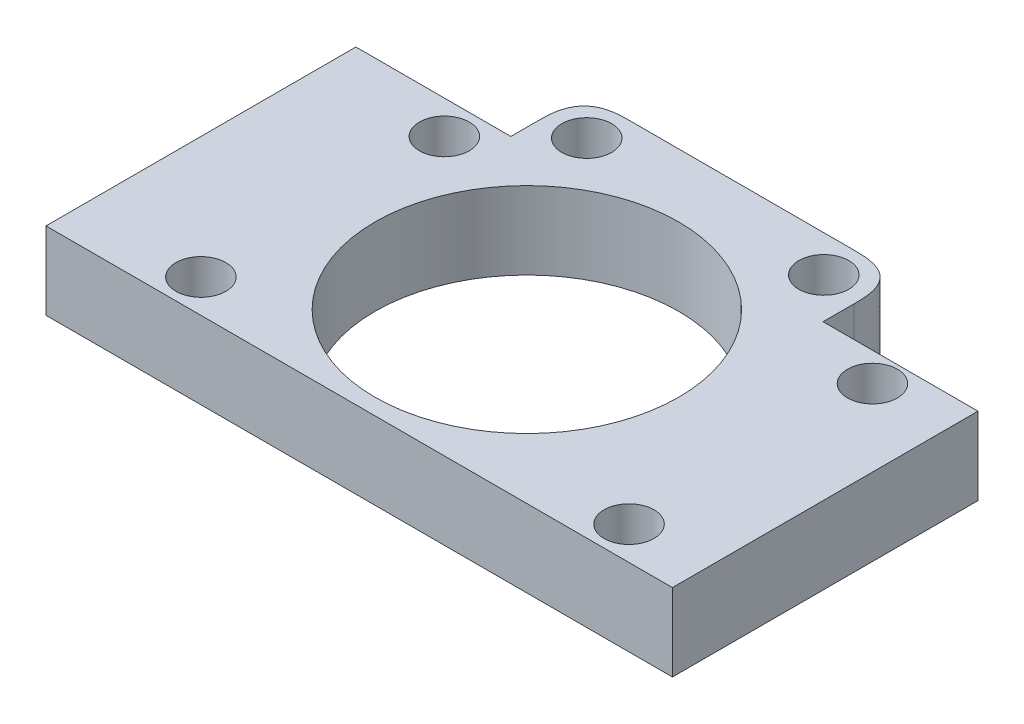
ISO-10303-21;
HEADER;
FILE_DESCRIPTION(('STEP AP214'),'2;1');
FILE_NAME('part.step','',(''),(''),'','','');
FILE_SCHEMA(('AUTOMOTIVE_DESIGN { 1 0 10303 214 1 1 1 1 }'));
ENDSEC;
DATA;
#1=APPLICATION_CONTEXT('core data for automotive mechanical design processes');
#2=APPLICATION_PROTOCOL_DEFINITION('international standard','automotive_design',2000,#1);
#3=PRODUCT_CONTEXT('',#1,'mechanical');
#4=PRODUCT('Part','Part','',(#3));
#5=PRODUCT_RELATED_PRODUCT_CATEGORY('part','',(#4));
#6=PRODUCT_DEFINITION_FORMATION('','',#4);
#7=PRODUCT_DEFINITION_CONTEXT('part definition',#1,'design');
#8=PRODUCT_DEFINITION('design','',#6,#7);
#9=PRODUCT_DEFINITION_SHAPE('','',#8);
#10=(LENGTH_UNIT() NAMED_UNIT(*) SI_UNIT(.MILLI.,.METRE.));
#11=(NAMED_UNIT(*) PLANE_ANGLE_UNIT() SI_UNIT($,.RADIAN.));
#12=(NAMED_UNIT(*) SI_UNIT($,.STERADIAN.) SOLID_ANGLE_UNIT());
#13=UNCERTAINTY_MEASURE_WITH_UNIT(LENGTH_MEASURE(1.E-05),#10,'distance_accuracy_value','');
#14=(GEOMETRIC_REPRESENTATION_CONTEXT(3) GLOBAL_UNCERTAINTY_ASSIGNED_CONTEXT((#13)) GLOBAL_UNIT_ASSIGNED_CONTEXT((#10,
#11,#12)) REPRESENTATION_CONTEXT('',''));
#15=CARTESIAN_POINT('',(0.,0.,0.));
#16=DIRECTION('',(0.,0.,1.));
#17=DIRECTION('',(1.,0.,0.));
#18=AXIS2_PLACEMENT_3D('',#15,#16,#17);
#19=CARTESIAN_POINT('',(-10.1929890126689,3.,-8.91469052277428));
#20=CARTESIAN_POINT('',(-10.1929890126689,0.999999999999783,-8.91469052277428));
#21=CARTESIAN_POINT('',(-10.1929890126689,-1.,-8.91469052277428));
#22=CARTESIAN_POINT('',(-10.1929890126689,-3.,-8.91469052277428));
#23=CARTESIAN_POINT('',(-10.1929890126689,3.,-9.41928467737612));
#24=CARTESIAN_POINT('',(-10.1929890126689,0.999999999999783,-9.41928467737612));
#25=CARTESIAN_POINT('',(-10.1929890126689,-1.,-9.41928467737612));
#26=CARTESIAN_POINT('',(-10.1929890126689,-3.,-9.41928467737612));
#27=CARTESIAN_POINT('',(-10.1929890126689,3.,-9.92387883197796));
#28=CARTESIAN_POINT('',(-10.1929890126689,0.999999999999783,-9.92387883197796));
#29=CARTESIAN_POINT('',(-10.1929890126689,-1.,-9.92387883197796));
#30=CARTESIAN_POINT('',(-10.1929890126689,-3.,-9.92387883197796));
#31=CARTESIAN_POINT('',(-9.97791325316063,3.,-11.0360108663339));
#32=CARTESIAN_POINT('',(-9.97791325316063,0.999999999999783,-11.0360108663339));
#33=CARTESIAN_POINT('',(-9.97791325316063,-1.,-11.0360108663322));
#34=CARTESIAN_POINT('',(-9.97791325316063,-3.,-11.0360108663339));
#35=CARTESIAN_POINT('',(-9.31430935622852,3.,-11.699614763266));
#36=CARTESIAN_POINT('',(-9.31430935622852,0.999999999999783,-11.699614763266));
#37=CARTESIAN_POINT('',(-9.31430935622852,-1.,-11.6996147632643));
#38=CARTESIAN_POINT('',(-9.31430935622852,-3.,-11.699614763266));
#39=CARTESIAN_POINT('',(-8.20217732187255,3.,-11.9146905227743));
#40=CARTESIAN_POINT('',(-8.20217732187255,0.999999999999783,-11.9146905227743));
#41=CARTESIAN_POINT('',(-8.20217732187255,-1.,-11.9146905227726));
#42=CARTESIAN_POINT('',(-8.20217732187255,-3.,-11.9146905227743));
#43=CARTESIAN_POINT('',(-7.69758316727071,3.,-11.9146905227743));
#44=CARTESIAN_POINT('',(-7.69758316727071,0.999999999999783,-11.9146905227743));
#45=CARTESIAN_POINT('',(-7.69758316727071,-1.,-11.9146905227726));
#46=CARTESIAN_POINT('',(-7.69758316727071,-3.,-11.9146905227743));
#47=CARTESIAN_POINT('',(-7.19298901266887,3.,-11.9146905227743));
#48=CARTESIAN_POINT('',(-7.19298901266887,0.999999999999783,-11.9146905227743));
#49=CARTESIAN_POINT('',(-7.19298901266887,-1.,-11.9146905227743));
#50=CARTESIAN_POINT('',(-7.19298901266887,-3.,-11.9146905227743));
#51=B_SPLINE_SURFACE_WITH_KNOTS('',5,3,((#19,#20,#21,#22),(#23,#24,#25,#26),(#27,#28,#29,#30),
(#31,#32,#33,#34),(#35,#36,#37,#38),(#39,#40,#41,#42),(#43,#44,#45,#46),(#47,#48,#49,#50)),
.UNSPECIFIED.,.F.,.F.,.F.,(6,2,6),(4,4),(0.,0.5,1.),(-0.0005,0.0055),.UNSPECIFIED.);
#52=CARTESIAN_POINT('',(-10.1929890126689,-3.,-8.91469052277428));
#53=CARTESIAN_POINT('',(-10.1929890126689,-1.,-8.91469052277428));
#54=CARTESIAN_POINT('',(-10.1929890126689,0.999999999999783,-8.91469052277428));
#55=CARTESIAN_POINT('',(-10.1929890126689,3.,-8.91469052277428));
#56=B_SPLINE_CURVE_WITH_KNOTS('',3,(#52,#53,#54,#55),.UNSPECIFIED.,.F.,.F.,(4,4),(-0.0005,
0.0055),.UNSPECIFIED.);
#57=CARTESIAN_POINT('',(-10.1929890126689,2.5,-8.91469052277428));
#58=VERTEX_POINT('',#57);
#59=CARTESIAN_POINT('',(-10.1929890126689,-2.5,-8.91469052277428));
#60=VERTEX_POINT('',#59);
#61=EDGE_CURVE('E359',#58,#60,#56,.F.);
#62=CARTESIAN_POINT('',(-10.1929890126689,2.5,-8.91469052277428));
#63=CARTESIAN_POINT('',(-10.1929890126689,2.5,-9.41928467737612));
#64=CARTESIAN_POINT('',(-10.1929890126689,2.5,-9.92387883197796));
#65=CARTESIAN_POINT('',(-9.97791325316063,2.5,-11.0360108663339));
#66=CARTESIAN_POINT('',(-9.31430935622852,2.5,-11.699614763266));
#67=CARTESIAN_POINT('',(-8.20217732187255,2.5,-11.9146905227743));
#68=CARTESIAN_POINT('',(-7.69758316727071,2.5,-11.9146905227743));
#69=CARTESIAN_POINT('',(-7.19298901266887,2.5,-11.9146905227743));
#70=B_SPLINE_CURVE_WITH_KNOTS('',5,(#62,#63,#64,#65,#66,#67,#68,#69),.UNSPECIFIED.,.F.,.F.,(6,2,
6),(0.,0.5,1.),.UNSPECIFIED.);
#71=CARTESIAN_POINT('',(-7.19298901266887,2.5,-11.9146905227743));
#72=VERTEX_POINT('',#71);
#73=EDGE_CURVE('E244',#72,#58,#70,.F.);
#74=CARTESIAN_POINT('',(-7.19298901266887,3.,-11.9146905227743));
#75=CARTESIAN_POINT('',(-7.19298901266887,0.999999999999783,-11.9146905227743));
#76=CARTESIAN_POINT('',(-7.19298901266887,-1.,-11.9146905227743));
#77=CARTESIAN_POINT('',(-7.19298901266887,-3.,-11.9146905227743));
#78=B_SPLINE_CURVE_WITH_KNOTS('',3,(#74,#75,#76,#77),.UNSPECIFIED.,.F.,.F.,(4,4),(-0.0005,
0.0055),.UNSPECIFIED.);
#79=CARTESIAN_POINT('',(-7.19298901266887,-2.5,-11.9146905227743));
#80=VERTEX_POINT('',#79);
#81=EDGE_CURVE('E483',#80,#72,#78,.F.);
#82=CARTESIAN_POINT('',(-7.19298901266887,-2.5,-11.9146905227743));
#83=CARTESIAN_POINT('',(-7.69758316727071,-2.5,-11.9146905227739));
#84=CARTESIAN_POINT('',(-8.20217732187255,-2.5,-11.9146905227739));
#85=CARTESIAN_POINT('',(-9.31430935622852,-2.5,-11.6996147632657));
#86=CARTESIAN_POINT('',(-9.97791325316063,-2.5,-11.0360108663336));
#87=CARTESIAN_POINT('',(-10.1929890126689,-2.5,-9.92387883197796));
#88=CARTESIAN_POINT('',(-10.1929890126689,-2.5,-9.41928467737612));
#89=CARTESIAN_POINT('',(-10.1929890126689,-2.5,-8.91469052277428));
#90=B_SPLINE_CURVE_WITH_KNOTS('',5,(#82,#83,#84,#85,#86,#87,#88,#89),.UNSPECIFIED.,.F.,.F.,(6,2,
6),(0.,0.5,1.),.UNSPECIFIED.);
#91=EDGE_CURVE('E12',#60,#80,#90,.F.);
#92=ORIENTED_EDGE('',*,*,#61,.F.);
#93=ORIENTED_EDGE('',*,*,#73,.F.);
#94=ORIENTED_EDGE('',*,*,#81,.F.);
#95=ORIENTED_EDGE('',*,*,#91,.F.);
#96=EDGE_LOOP('',(#92,#93,#94,#95));
#97=FACE_BOUND('',#96,.T.);
#98=ADVANCED_FACE('F230',(#97),#51,.T.);
#99=CARTESIAN_POINT('',(10.2370109873311,-3.,-8.91469052277429));
#100=CARTESIAN_POINT('',(10.2370109873311,-1.,-8.91469052277429));
#101=CARTESIAN_POINT('',(10.2370109873311,0.999999999999349,-8.91469052277429));
#102=CARTESIAN_POINT('',(10.2370109873311,3.,-8.91469052277429));
#103=CARTESIAN_POINT('',(10.2370109873311,-3.,-9.41928467737613));
#104=CARTESIAN_POINT('',(10.2370109873311,-1.,-9.41928467737613));
#105=CARTESIAN_POINT('',(10.2370109873311,0.999999999999349,-9.41928467737613));
#106=CARTESIAN_POINT('',(10.2370109873311,3.,-9.41928467737613));
#107=CARTESIAN_POINT('',(10.2370109873311,-3.,-9.92387883197797));
#108=CARTESIAN_POINT('',(10.2370109873311,-1.,-9.92387883197797));
#109=CARTESIAN_POINT('',(10.2370109873311,0.999999999999349,-9.92387883197797));
#110=CARTESIAN_POINT('',(10.2370109873311,3.,-9.92387883197797));
#111=CARTESIAN_POINT('',(10.0219352278229,-3.,-11.0360108663339));
#112=CARTESIAN_POINT('',(10.0219352278211,-1.,-11.0360108663357));
#113=CARTESIAN_POINT('',(10.0219352278211,0.999999999999349,-11.0360108663357));
#114=CARTESIAN_POINT('',(10.0219352278229,3.,-11.0360108663339));
#115=CARTESIAN_POINT('',(9.35833133089077,-3.,-11.699614763266));
#116=CARTESIAN_POINT('',(9.35833133089077,-1.,-11.699614763266));
#117=CARTESIAN_POINT('',(9.35833133089077,0.999999999999349,-11.699614763266));
#118=CARTESIAN_POINT('',(9.35833133089077,3.,-11.699614763266));
#119=CARTESIAN_POINT('',(8.24619929653481,-3.,-11.9146905227743));
#120=CARTESIAN_POINT('',(8.24619929653654,-1.,-11.9146905227726));
#121=CARTESIAN_POINT('',(8.24619929653654,0.999999999999349,-11.9146905227726));
#122=CARTESIAN_POINT('',(8.24619929653481,3.,-11.9146905227743));
#123=CARTESIAN_POINT('',(7.74160514193297,-3.,-11.9146905227743));
#124=CARTESIAN_POINT('',(7.74160514193297,-1.,-11.9146905227726));
#125=CARTESIAN_POINT('',(7.74160514193297,0.999999999999349,-11.9146905227726));
#126=CARTESIAN_POINT('',(7.74160514193297,3.,-11.9146905227743));
#127=CARTESIAN_POINT('',(7.23701098733113,-3.,-11.9146905227743));
#128=CARTESIAN_POINT('',(7.23701098733113,-1.,-11.9146905227743));
#129=CARTESIAN_POINT('',(7.23701098733113,0.999999999999349,-11.9146905227743));
#130=CARTESIAN_POINT('',(7.23701098733113,3.,-11.9146905227743));
#131=B_SPLINE_SURFACE_WITH_KNOTS('',5,3,((#99,#100,#101,#102),(#103,#104,#105,#106),(#107,#108,
#109,#110),(#111,#112,#113,#114),(#115,#116,#117,#118),(#119,#120,#121,#122),(#123,#124,#125,
#126),(#127,#128,#129,#130)),.UNSPECIFIED.,.F.,.F.,.F.,(6,2,6),(4,4),(0.,0.5,1.),(-0.0055,
0.0005),.UNSPECIFIED.);
#132=CARTESIAN_POINT('',(10.2370109873311,3.,-8.91469052277429));
#133=CARTESIAN_POINT('',(10.2370109873311,0.999999999999349,-8.91469052277429));
#134=CARTESIAN_POINT('',(10.2370109873311,-1.,-8.91469052277429));
#135=CARTESIAN_POINT('',(10.2370109873311,-3.,-8.91469052277429));
#136=B_SPLINE_CURVE_WITH_KNOTS('',3,(#132,#133,#134,#135),.UNSPECIFIED.,.F.,.F.,(4,4),(-0.0055,
0.0005),.UNSPECIFIED.);
#137=CARTESIAN_POINT('',(10.2370109873311,-2.5,-8.91469052277429));
#138=VERTEX_POINT('',#137);
#139=CARTESIAN_POINT('',(10.2370109873311,2.5,-8.91469052277429));
#140=VERTEX_POINT('',#139);
#141=EDGE_CURVE('E429',#138,#140,#136,.F.);
#142=CARTESIAN_POINT('',(10.2370109873311,-2.5,-8.91469052277429));
#143=CARTESIAN_POINT('',(10.2370109873311,-2.5,-9.41928467737613));
#144=CARTESIAN_POINT('',(10.2370109873311,-2.5,-9.92387883197797));
#145=CARTESIAN_POINT('',(10.0219352278225,-2.5,-11.0360108663343));
#146=CARTESIAN_POINT('',(9.35833133089077,-2.5,-11.699614763266));
#147=CARTESIAN_POINT('',(8.24619929653521,-2.5,-11.9146905227739));
#148=CARTESIAN_POINT('',(7.74160514193297,-2.5,-11.9146905227739));
#149=CARTESIAN_POINT('',(7.23701098733113,-2.5,-11.9146905227743));
#150=B_SPLINE_CURVE_WITH_KNOTS('',5,(#142,#143,#144,#145,#146,#147,#148,#149),.UNSPECIFIED.,.F.,
.F.,(6,2,6),(0.,0.5,1.),.UNSPECIFIED.);
#151=CARTESIAN_POINT('',(7.23701098733113,-2.5,-11.9146905227743));
#152=VERTEX_POINT('',#151);
#153=EDGE_CURVE('E436',#152,#138,#150,.F.);
#154=CARTESIAN_POINT('',(7.23701098733113,-3.,-11.9146905227743));
#155=CARTESIAN_POINT('',(7.23701098733113,-1.,-11.9146905227743));
#156=CARTESIAN_POINT('',(7.23701098733113,0.999999999999349,-11.9146905227743));
#157=CARTESIAN_POINT('',(7.23701098733113,3.,-11.9146905227743));
#158=B_SPLINE_CURVE_WITH_KNOTS('',3,(#154,#155,#156,#157),.UNSPECIFIED.,.F.,.F.,(4,4),(-0.0055,
0.0005),.UNSPECIFIED.);
#159=CARTESIAN_POINT('',(7.23701098733113,2.5,-11.9146905227743));
#160=VERTEX_POINT('',#159);
#161=EDGE_CURVE('E432',#160,#152,#158,.F.);
#162=CARTESIAN_POINT('',(7.23701098733113,2.5,-11.9146905227743));
#163=CARTESIAN_POINT('',(7.74160514193297,2.5,-11.9146905227739));
#164=CARTESIAN_POINT('',(8.2461992965352,2.5,-11.9146905227739));
#165=CARTESIAN_POINT('',(9.35833133089077,2.5,-11.699614763266));
#166=CARTESIAN_POINT('',(10.0219352278225,2.5,-11.0360108663343));
#167=CARTESIAN_POINT('',(10.2370109873311,2.5,-9.92387883197797));
#168=CARTESIAN_POINT('',(10.2370109873311,2.5,-9.41928467737613));
#169=CARTESIAN_POINT('',(10.2370109873311,2.5,-8.91469052277429));
#170=B_SPLINE_CURVE_WITH_KNOTS('',5,(#162,#163,#164,#165,#166,#167,#168,#169),.UNSPECIFIED.,.F.,
.F.,(6,2,6),(0.,0.5,1.),.UNSPECIFIED.);
#171=EDGE_CURVE('E420',#140,#160,#170,.F.);
#172=ORIENTED_EDGE('',*,*,#141,.F.);
#173=ORIENTED_EDGE('',*,*,#153,.F.);
#174=ORIENTED_EDGE('',*,*,#161,.F.);
#175=ORIENTED_EDGE('',*,*,#171,.F.);
#176=EDGE_LOOP('',(#172,#173,#174,#175));
#177=FACE_BOUND('',#176,.T.);
#178=ADVANCED_FACE('F382',(#177),#131,.T.);
#179=CARTESIAN_POINT('',(0.,2.5,0.));
#180=DIRECTION('',(0.,1.,0.));
#181=DIRECTION('',(0.,0.,1.));
#182=AXIS2_PLACEMENT_3D('',#179,#180,#181);
#183=PLANE('',#182);
#184=CARTESIAN_POINT('',(7.64576839590492,2.5,-9.55353549817908));
#185=DIRECTION('',(0.,1.,0.));
#186=DIRECTION('',(0.,0.,1.));
#187=AXIS2_PLACEMENT_3D('',#184,#185,#186);
#188=CIRCLE('',#187,1.61029889540952);
#189=CARTESIAN_POINT('',(7.64576839590492,2.5,-7.94323660276957));
#190=VERTEX_POINT('',#189);
#191=EDGE_CURVE('E659',#190,#190,#188,.T.);
#192=ORIENTED_EDGE('',*,*,#191,.F.);
#193=EDGE_LOOP('',(#192));
#194=FACE_BOUND('',#193,.T.);
#195=CARTESIAN_POINT('',(15.2901081666769,2.5,10.6606083726352));
#196=DIRECTION('',(0.,1.,0.));
#197=DIRECTION('',(0.,0.,1.));
#198=AXIS2_PLACEMENT_3D('',#195,#196,#197);
#199=CIRCLE('',#198,1.61029889540952);
#200=CARTESIAN_POINT('',(15.2901081666769,2.5,12.2709072680447));
#201=VERTEX_POINT('',#200);
#202=EDGE_CURVE('E643',#201,#201,#199,.T.);
#203=ORIENTED_EDGE('',*,*,#202,.F.);
#204=EDGE_LOOP('',(#203));
#205=FACE_BOUND('',#204,.T.);
#206=CARTESIAN_POINT('',(-12.3398918333231,2.5,10.6605087408321));
#207=DIRECTION('',(0.,1.,0.));
#208=DIRECTION('',(0.,0.,1.));
#209=AXIS2_PLACEMENT_3D('',#206,#207,#208);
#210=CIRCLE('',#209,1.61019926360635);
#211=CARTESIAN_POINT('',(-12.3398918333231,2.5,12.2707080044384));
#212=VERTEX_POINT('',#211);
#213=EDGE_CURVE('E628',#212,#212,#210,.T.);
#214=ORIENTED_EDGE('',*,*,#213,.F.);
#215=EDGE_LOOP('',(#214));
#216=FACE_BOUND('',#215,.T.);
#217=DIRECTION('',(1.,0.,0.));
#218=VECTOR('',#217,1.);
#219=CARTESIAN_POINT('',(-10.1929890126689,2.5,-11.9146905227743));
#220=LINE('',#219,#218);
#221=EDGE_CURVE('E334',#72,#160,#220,.T.);
#222=ORIENTED_EDGE('',*,*,#221,.F.);
#223=ORIENTED_EDGE('',*,*,#73,.T.);
#224=DIRECTION('',(0.,0.,-1.));
#225=VECTOR('',#224,1.);
#226=CARTESIAN_POINT('',(-10.1929890126689,2.5,-7.19469052277429));
#227=LINE('',#226,#225);
#228=CARTESIAN_POINT('',(-10.1929890126689,2.5,-7.19469052277429));
#229=VERTEX_POINT('',#228);
#230=EDGE_CURVE('E316',#229,#58,#227,.T.);
#231=ORIENTED_EDGE('',*,*,#230,.F.);
#232=DIRECTION('',(1.,0.,0.));
#233=VECTOR('',#232,1.);
#234=CARTESIAN_POINT('',(-20.1929890126689,2.5,-7.19469052277429));
#235=LINE('',#234,#233);
#236=CARTESIAN_POINT('',(-20.1929890126689,2.5,-7.19469052277429));
#237=VERTEX_POINT('',#236);
#238=EDGE_CURVE('E331',#237,#229,#235,.T.);
#239=ORIENTED_EDGE('',*,*,#238,.F.);
#240=DIRECTION('',(0.,0.,1.));
#241=VECTOR('',#240,1.);
#242=CARTESIAN_POINT('',(-20.1929890126689,2.5,-7.19469052277429));
#243=LINE('',#242,#241);
#244=CARTESIAN_POINT('',(-20.1929890126689,2.5,12.8053094772257));
#245=VERTEX_POINT('',#244);
#246=EDGE_CURVE('E324',#237,#245,#243,.T.);
#247=ORIENTED_EDGE('',*,*,#246,.T.);
#248=DIRECTION('',(-1.,0.,0.));
#249=VECTOR('',#248,1.);
#250=CARTESIAN_POINT('',(20.2370109873311,2.5,12.8053094772257));
#251=LINE('',#250,#249);
#252=CARTESIAN_POINT('',(20.2370109873311,2.5,12.8053094772257));
#253=VERTEX_POINT('',#252);
#254=EDGE_CURVE('E463',#253,#245,#251,.T.);
#255=ORIENTED_EDGE('',*,*,#254,.F.);
#256=DIRECTION('',(0.,0.,1.));
#257=VECTOR('',#256,1.);
#258=CARTESIAN_POINT('',(20.2370109873311,2.5,-6.91469052277429));
#259=LINE('',#258,#257);
#260=CARTESIAN_POINT('',(20.2370109873311,2.5,-6.91469052277429));
#261=VERTEX_POINT('',#260);
#262=EDGE_CURVE('E454',#261,#253,#259,.T.);
#263=ORIENTED_EDGE('',*,*,#262,.F.);
#264=DIRECTION('',(1.,0.,0.));
#265=VECTOR('',#264,1.);
#266=CARTESIAN_POINT('',(10.2370109873311,2.5,-6.91469052277429));
#267=LINE('',#266,#265);
#268=CARTESIAN_POINT('',(10.2370109873311,2.5,-6.91469052277429));
#269=VERTEX_POINT('',#268);
#270=EDGE_CURVE('E450',#269,#261,#267,.T.);
#271=ORIENTED_EDGE('',*,*,#270,.F.);
#272=DIRECTION('',(0.,0.,1.));
#273=VECTOR('',#272,1.);
#274=CARTESIAN_POINT('',(10.2370109873311,2.5,-11.9146905227743));
#275=LINE('',#274,#273);
#276=EDGE_CURVE('E441',#140,#269,#275,.T.);
#277=ORIENTED_EDGE('',*,*,#276,.F.);
#278=ORIENTED_EDGE('',*,*,#171,.T.);
#279=EDGE_LOOP('',(#222,#223,#231,#239,#247,#255,#263,#271,#277,#278));
#280=FACE_BOUND('',#279,.T.);
#281=CARTESIAN_POINT('',(-12.3398918333231,2.5,-5.04969052277429));
#282=DIRECTION('',(0.,1.,0.));
#283=DIRECTION('',(0.,0.,1.));
#284=AXIS2_PLACEMENT_3D('',#281,#282,#283);
#285=CIRCLE('',#284,1.61);
#286=CARTESIAN_POINT('',(-12.3398918333231,2.5,-3.43969052277429));
#287=VERTEX_POINT('',#286);
#288=EDGE_CURVE('E471',#287,#287,#285,.T.);
#289=ORIENTED_EDGE('',*,*,#288,.F.);
#290=EDGE_LOOP('',(#289));
#291=FACE_BOUND('',#290,.T.);
#292=CARTESIAN_POINT('',(0.,2.5,1.96530947722571));
#293=DIRECTION('',(0.,1.,0.));
#294=DIRECTION('',(0.,0.,1.));
#295=AXIS2_PLACEMENT_3D('',#292,#293,#294);
#296=CIRCLE('',#295,9.8);
#297=CARTESIAN_POINT('',(0.,2.5,11.7653094772257));
#298=VERTEX_POINT('',#297);
#299=EDGE_CURVE('E635',#298,#298,#296,.T.);
#300=ORIENTED_EDGE('',*,*,#299,.F.);
#301=EDGE_LOOP('',(#300));
#302=FACE_BOUND('',#301,.T.);
#303=CARTESIAN_POINT('',(15.2901081666769,2.5,-5.04969052277429));
#304=DIRECTION('',(0.,1.,0.));
#305=DIRECTION('',(0.,0.,1.));
#306=AXIS2_PLACEMENT_3D('',#303,#304,#305);
#307=CIRCLE('',#306,1.61000000000001);
#308=CARTESIAN_POINT('',(15.2901081666769,2.5,-3.43969052277429));
#309=VERTEX_POINT('',#308);
#310=EDGE_CURVE('E651',#309,#309,#307,.T.);
#311=ORIENTED_EDGE('',*,*,#310,.F.);
#312=EDGE_LOOP('',(#311));
#313=FACE_BOUND('',#312,.T.);
#314=CARTESIAN_POINT('',(-7.65376201202699,2.5,-9.55353549817908));
#315=DIRECTION('',(0.,1.,0.));
#316=DIRECTION('',(0.,0.,1.));
#317=AXIS2_PLACEMENT_3D('',#314,#315,#316);
#318=CIRCLE('',#317,1.61029889540952);
#319=CARTESIAN_POINT('',(-7.65376201202699,2.5,-7.94323660276957));
#320=VERTEX_POINT('',#319);
#321=EDGE_CURVE('E667',#320,#320,#318,.T.);
#322=ORIENTED_EDGE('',*,*,#321,.F.);
#323=EDGE_LOOP('',(#322));
#324=FACE_BOUND('',#323,.T.);
#325=ADVANCED_FACE('F329',(#194,#205,#216,#280,#291,#302,#313,#324),#183,.T.);
#326=CARTESIAN_POINT('',(0.,-2.5,0.));
#327=DIRECTION('',(0.,1.,0.));
#328=DIRECTION('',(0.,0.,1.));
#329=AXIS2_PLACEMENT_3D('',#326,#327,#328);
#330=PLANE('',#329);
#331=DIRECTION('',(0.,0.,-1.));
#332=VECTOR('',#331,1.);
#333=CARTESIAN_POINT('',(-10.1929890126689,-2.5,-7.19469052277429));
#334=LINE('',#333,#332);
#335=CARTESIAN_POINT('',(-10.1929890126689,-2.5,-7.19469052277429));
#336=VERTEX_POINT('',#335);
#337=EDGE_CURVE('E317',#336,#60,#334,.T.);
#338=ORIENTED_EDGE('',*,*,#337,.T.);
#339=ORIENTED_EDGE('',*,*,#91,.T.);
#340=DIRECTION('',(1.,0.,0.));
#341=VECTOR('',#340,1.);
#342=CARTESIAN_POINT('',(-10.1929890126689,-2.5,-11.9146905227743));
#343=LINE('',#342,#341);
#344=EDGE_CURVE('E477',#80,#152,#343,.T.);
#345=ORIENTED_EDGE('',*,*,#344,.T.);
#346=ORIENTED_EDGE('',*,*,#153,.T.);
#347=DIRECTION('',(0.,0.,1.));
#348=VECTOR('',#347,1.);
#349=CARTESIAN_POINT('',(10.2370109873311,-2.5,-11.9146905227743));
#350=LINE('',#349,#348);
#351=CARTESIAN_POINT('',(10.2370109873311,-2.5,-6.91469052277429));
#352=VERTEX_POINT('',#351);
#353=EDGE_CURVE('E443',#138,#352,#350,.T.);
#354=ORIENTED_EDGE('',*,*,#353,.T.);
#355=DIRECTION('',(1.,0.,0.));
#356=VECTOR('',#355,1.);
#357=CARTESIAN_POINT('',(10.2370109873311,-2.5,-6.91469052277429));
#358=LINE('',#357,#356);
#359=CARTESIAN_POINT('',(20.2370109873311,-2.5,-6.91469052277429));
#360=VERTEX_POINT('',#359);
#361=EDGE_CURVE('E618',#352,#360,#358,.T.);
#362=ORIENTED_EDGE('',*,*,#361,.T.);
#363=DIRECTION('',(0.,0.,1.));
#364=VECTOR('',#363,1.);
#365=CARTESIAN_POINT('',(20.2370109873311,-2.5,-6.91469052277429));
#366=LINE('',#365,#364);
#367=CARTESIAN_POINT('',(20.2370109873311,-2.5,12.8053094772257));
#368=VERTEX_POINT('',#367);
#369=EDGE_CURVE('E615',#360,#368,#366,.T.);
#370=ORIENTED_EDGE('',*,*,#369,.T.);
#371=DIRECTION('',(-1.,0.,0.));
#372=VECTOR('',#371,1.);
#373=CARTESIAN_POINT('',(20.2370109873311,-2.5,12.8053094772257));
#374=LINE('',#373,#372);
#375=CARTESIAN_POINT('',(-20.1929890126689,-2.5,12.8053094772257));
#376=VERTEX_POINT('',#375);
#377=EDGE_CURVE('E344',#368,#376,#374,.T.);
#378=ORIENTED_EDGE('',*,*,#377,.T.);
#379=DIRECTION('',(0.,0.,1.));
#380=VECTOR('',#379,1.);
#381=CARTESIAN_POINT('',(-20.1929890126689,-2.5,-7.19469052277429));
#382=LINE('',#381,#380);
#383=CARTESIAN_POINT('',(-20.1929890126689,-2.5,-7.19469052277429));
#384=VERTEX_POINT('',#383);
#385=EDGE_CURVE('E340',#384,#376,#382,.T.);
#386=ORIENTED_EDGE('',*,*,#385,.F.);
#387=DIRECTION('',(1.,0.,0.));
#388=VECTOR('',#387,1.);
#389=CARTESIAN_POINT('',(-20.1929890126689,-2.5,-7.19469052277429));
#390=LINE('',#389,#388);
#391=EDGE_CURVE('E469',#384,#336,#390,.T.);
#392=ORIENTED_EDGE('',*,*,#391,.T.);
#393=EDGE_LOOP('',(#338,#339,#345,#346,#354,#362,#370,#378,#386,#392));
#394=FACE_BOUND('',#393,.T.);
#395=CARTESIAN_POINT('',(-12.3398918333231,-2.5,-5.04969052277429));
#396=DIRECTION('',(0.,1.,0.));
#397=DIRECTION('',(0.,0.,1.));
#398=AXIS2_PLACEMENT_3D('',#395,#396,#397);
#399=CIRCLE('',#398,1.61);
#400=CARTESIAN_POINT('',(-12.3398918333231,-2.5,-3.43969052277429));
#401=VERTEX_POINT('',#400);
#402=EDGE_CURVE('E348',#401,#401,#399,.T.);
#403=ORIENTED_EDGE('',*,*,#402,.T.);
#404=EDGE_LOOP('',(#403));
#405=FACE_BOUND('',#404,.T.);
#406=CARTESIAN_POINT('',(-12.3398918333231,-2.5,10.6605087408321));
#407=DIRECTION('',(0.,1.,0.));
#408=DIRECTION('',(0.,0.,1.));
#409=AXIS2_PLACEMENT_3D('',#406,#407,#408);
#410=CIRCLE('',#409,1.61019926360635);
#411=CARTESIAN_POINT('',(-12.3398918333231,-2.5,12.2707080044384));
#412=VERTEX_POINT('',#411);
#413=EDGE_CURVE('E631',#412,#412,#410,.T.);
#414=ORIENTED_EDGE('',*,*,#413,.T.);
#415=EDGE_LOOP('',(#414));
#416=FACE_BOUND('',#415,.T.);
#417=CARTESIAN_POINT('',(0.,-2.5,1.96530947722571));
#418=DIRECTION('',(0.,1.,0.));
#419=DIRECTION('',(0.,0.,1.));
#420=AXIS2_PLACEMENT_3D('',#417,#418,#419);
#421=CIRCLE('',#420,9.8);
#422=CARTESIAN_POINT('',(0.,-2.5,11.7653094772257));
#423=VERTEX_POINT('',#422);
#424=EDGE_CURVE('E639',#423,#423,#421,.T.);
#425=ORIENTED_EDGE('',*,*,#424,.T.);
#426=EDGE_LOOP('',(#425));
#427=FACE_BOUND('',#426,.T.);
#428=CARTESIAN_POINT('',(15.2901081666769,-2.5,10.6606083726352));
#429=DIRECTION('',(0.,1.,0.));
#430=DIRECTION('',(0.,0.,1.));
#431=AXIS2_PLACEMENT_3D('',#428,#429,#430);
#432=CIRCLE('',#431,1.61029889540952);
#433=CARTESIAN_POINT('',(15.2901081666769,-2.5,12.2709072680447));
#434=VERTEX_POINT('',#433);
#435=EDGE_CURVE('E647',#434,#434,#432,.T.);
#436=ORIENTED_EDGE('',*,*,#435,.T.);
#437=EDGE_LOOP('',(#436));
#438=FACE_BOUND('',#437,.T.);
#439=CARTESIAN_POINT('',(15.2901081666769,-2.5,-5.04969052277429));
#440=DIRECTION('',(0.,1.,0.));
#441=DIRECTION('',(0.,0.,1.));
#442=AXIS2_PLACEMENT_3D('',#439,#440,#441);
#443=CIRCLE('',#442,1.61000000000001);
#444=CARTESIAN_POINT('',(15.2901081666769,-2.5,-3.43969052277429));
#445=VERTEX_POINT('',#444);
#446=EDGE_CURVE('E655',#445,#445,#443,.T.);
#447=ORIENTED_EDGE('',*,*,#446,.T.);
#448=EDGE_LOOP('',(#447));
#449=FACE_BOUND('',#448,.T.);
#450=CARTESIAN_POINT('',(7.64576839590492,-2.5,-9.55353549817908));
#451=DIRECTION('',(0.,1.,0.));
#452=DIRECTION('',(0.,0.,1.));
#453=AXIS2_PLACEMENT_3D('',#450,#451,#452);
#454=CIRCLE('',#453,1.61029889540952);
#455=CARTESIAN_POINT('',(7.64576839590492,-2.5,-7.94323660276957));
#456=VERTEX_POINT('',#455);
#457=EDGE_CURVE('E663',#456,#456,#454,.T.);
#458=ORIENTED_EDGE('',*,*,#457,.T.);
#459=EDGE_LOOP('',(#458));
#460=FACE_BOUND('',#459,.T.);
#461=CARTESIAN_POINT('',(-7.65376201202699,-2.5,-9.55353549817908));
#462=DIRECTION('',(0.,1.,0.));
#463=DIRECTION('',(0.,0.,1.));
#464=AXIS2_PLACEMENT_3D('',#461,#462,#463);
#465=CIRCLE('',#464,1.61029889540952);
#466=CARTESIAN_POINT('',(-7.65376201202699,-2.5,-7.94323660276957));
#467=VERTEX_POINT('',#466);
#468=EDGE_CURVE('E671',#467,#467,#465,.T.);
#469=ORIENTED_EDGE('',*,*,#468,.T.);
#470=EDGE_LOOP('',(#469));
#471=FACE_BOUND('',#470,.T.);
#472=ADVANCED_FACE('F380',(#394,#405,#416,#427,#438,#449,#460,#471),#330,.F.);
#473=CARTESIAN_POINT('',(-20.1929890126689,2.5,-7.19469052277429));
#474=DIRECTION('',(0.,0.,-1.));
#475=DIRECTION('',(-1.,0.,0.));
#476=AXIS2_PLACEMENT_3D('',#473,#474,#475);
#477=PLANE('',#476);
#478=ORIENTED_EDGE('',*,*,#391,.F.);
#479=DIRECTION('',(0.,-1.,0.));
#480=VECTOR('',#479,1.);
#481=CARTESIAN_POINT('',(-20.1929890126689,2.5,-7.19469052277429));
#482=LINE('',#481,#480);
#483=EDGE_CURVE('E337',#237,#384,#482,.T.);
#484=ORIENTED_EDGE('',*,*,#483,.F.);
#485=ORIENTED_EDGE('',*,*,#238,.T.);
#486=DIRECTION('',(0.,-1.,0.));
#487=VECTOR('',#486,1.);
#488=CARTESIAN_POINT('',(-10.1929890126689,2.5,-7.19469052277429));
#489=LINE('',#488,#487);
#490=EDGE_CURVE('E312',#229,#336,#489,.T.);
#491=ORIENTED_EDGE('',*,*,#490,.T.);
#492=EDGE_LOOP('',(#478,#484,#485,#491));
#493=FACE_BOUND('',#492,.T.);
#494=ADVANCED_FACE('F336',(#493),#477,.T.);
#495=CARTESIAN_POINT('',(-20.1929890126689,2.5,-7.19469052277429));
#496=DIRECTION('',(1.,0.,0.));
#497=DIRECTION('',(0.,0.,-1.));
#498=AXIS2_PLACEMENT_3D('',#495,#496,#497);
#499=PLANE('',#498);
#500=ORIENTED_EDGE('',*,*,#385,.T.);
#501=DIRECTION('',(0.,-1.,0.));
#502=VECTOR('',#501,1.);
#503=CARTESIAN_POINT('',(-20.1929890126689,2.5,12.8053094772257));
#504=LINE('',#503,#502);
#505=EDGE_CURVE('E599',#245,#376,#504,.T.);
#506=ORIENTED_EDGE('',*,*,#505,.F.);
#507=ORIENTED_EDGE('',*,*,#246,.F.);
#508=ORIENTED_EDGE('',*,*,#483,.T.);
#509=EDGE_LOOP('',(#500,#506,#507,#508));
#510=FACE_BOUND('',#509,.T.);
#511=ADVANCED_FACE('F379',(#510),#499,.F.);
#512=CARTESIAN_POINT('',(20.2370109873311,2.5,12.8053094772257));
#513=DIRECTION('',(0.,0.,1.));
#514=DIRECTION('',(1.,0.,0.));
#515=AXIS2_PLACEMENT_3D('',#512,#513,#514);
#516=PLANE('',#515);
#517=ORIENTED_EDGE('',*,*,#377,.F.);
#518=DIRECTION('',(0.,-1.,0.));
#519=VECTOR('',#518,1.);
#520=CARTESIAN_POINT('',(20.2370109873311,2.5,12.8053094772257));
#521=LINE('',#520,#519);
#522=EDGE_CURVE('E602',#253,#368,#521,.T.);
#523=ORIENTED_EDGE('',*,*,#522,.F.);
#524=ORIENTED_EDGE('',*,*,#254,.T.);
#525=ORIENTED_EDGE('',*,*,#505,.T.);
#526=EDGE_LOOP('',(#517,#523,#524,#525));
#527=FACE_BOUND('',#526,.T.);
#528=ADVANCED_FACE('F553',(#527),#516,.T.);
#529=CARTESIAN_POINT('',(20.2370109873311,2.5,-6.91469052277429));
#530=DIRECTION('',(1.,0.,0.));
#531=DIRECTION('',(0.,0.,-1.));
#532=AXIS2_PLACEMENT_3D('',#529,#530,#531);
#533=PLANE('',#532);
#534=ORIENTED_EDGE('',*,*,#369,.F.);
#535=DIRECTION('',(0.,-1.,0.));
#536=VECTOR('',#535,1.);
#537=CARTESIAN_POINT('',(20.2370109873311,2.5,-6.91469052277429));
#538=LINE('',#537,#536);
#539=EDGE_CURVE('E605',#261,#360,#538,.T.);
#540=ORIENTED_EDGE('',*,*,#539,.F.);
#541=ORIENTED_EDGE('',*,*,#262,.T.);
#542=ORIENTED_EDGE('',*,*,#522,.T.);
#543=EDGE_LOOP('',(#534,#540,#541,#542));
#544=FACE_BOUND('',#543,.T.);
#545=ADVANCED_FACE('F549',(#544),#533,.T.);
#546=CARTESIAN_POINT('',(10.2370109873311,2.5,-6.91469052277429));
#547=DIRECTION('',(0.,0.,-1.));
#548=DIRECTION('',(-1.,0.,0.));
#549=AXIS2_PLACEMENT_3D('',#546,#547,#548);
#550=PLANE('',#549);
#551=ORIENTED_EDGE('',*,*,#361,.F.);
#552=DIRECTION('',(0.,-1.,0.));
#553=VECTOR('',#552,1.);
#554=CARTESIAN_POINT('',(10.2370109873311,2.5,-6.91469052277429));
#555=LINE('',#554,#553);
#556=EDGE_CURVE('E323',#269,#352,#555,.T.);
#557=ORIENTED_EDGE('',*,*,#556,.F.);
#558=ORIENTED_EDGE('',*,*,#270,.T.);
#559=ORIENTED_EDGE('',*,*,#539,.T.);
#560=EDGE_LOOP('',(#551,#557,#558,#559));
#561=FACE_BOUND('',#560,.T.);
#562=ADVANCED_FACE('F546',(#561),#550,.T.);
#563=CARTESIAN_POINT('',(10.2370109873311,2.5,-11.9146905227743));
#564=DIRECTION('',(1.,0.,0.));
#565=DIRECTION('',(0.,0.,-1.));
#566=AXIS2_PLACEMENT_3D('',#563,#564,#565);
#567=PLANE('',#566);
#568=ORIENTED_EDGE('',*,*,#353,.F.);
#569=ORIENTED_EDGE('',*,*,#141,.T.);
#570=ORIENTED_EDGE('',*,*,#276,.T.);
#571=ORIENTED_EDGE('',*,*,#556,.T.);
#572=EDGE_LOOP('',(#568,#569,#570,#571));
#573=FACE_BOUND('',#572,.T.);
#574=ADVANCED_FACE('F439',(#573),#567,.T.);
#575=CARTESIAN_POINT('',(-10.1929890126689,2.5,-11.9146905227743));
#576=DIRECTION('',(0.,0.,-1.));
#577=DIRECTION('',(-1.,0.,0.));
#578=AXIS2_PLACEMENT_3D('',#575,#576,#577);
#579=PLANE('',#578);
#580=ORIENTED_EDGE('',*,*,#344,.F.);
#581=ORIENTED_EDGE('',*,*,#81,.T.);
#582=ORIENTED_EDGE('',*,*,#221,.T.);
#583=ORIENTED_EDGE('',*,*,#161,.T.);
#584=EDGE_LOOP('',(#580,#581,#582,#583));
#585=FACE_BOUND('',#584,.T.);
#586=ADVANCED_FACE('F375',(#585),#579,.T.);
#587=CARTESIAN_POINT('',(-10.1929890126689,2.5,-7.19469052277429));
#588=DIRECTION('',(-1.,0.,0.));
#589=DIRECTION('',(0.,0.,1.));
#590=AXIS2_PLACEMENT_3D('',#587,#588,#589);
#591=PLANE('',#590);
#592=ORIENTED_EDGE('',*,*,#230,.T.);
#593=ORIENTED_EDGE('',*,*,#61,.T.);
#594=ORIENTED_EDGE('',*,*,#337,.F.);
#595=ORIENTED_EDGE('',*,*,#490,.F.);
#596=EDGE_LOOP('',(#592,#593,#594,#595));
#597=FACE_BOUND('',#596,.T.);
#598=ADVANCED_FACE('F314',(#597),#591,.T.);
#599=CARTESIAN_POINT('',(-12.3398918333231,2.5,-5.04969052277429));
#600=DIRECTION('',(0.,-1.,0.));
#601=DIRECTION('',(0.,0.,-1.));
#602=AXIS2_PLACEMENT_3D('',#599,#600,#601);
#603=CYLINDRICAL_SURFACE('',#602,1.61);
#604=ORIENTED_EDGE('',*,*,#288,.T.);
#605=EDGE_LOOP('',(#604));
#606=FACE_BOUND('',#605,.T.);
#607=ORIENTED_EDGE('',*,*,#402,.F.);
#608=EDGE_LOOP('',(#607));
#609=FACE_BOUND('',#608,.T.);
#610=ADVANCED_FACE('F374',(#606,#609),#603,.F.);
#611=CARTESIAN_POINT('',(-12.3398918333231,2.5,10.6605087408321));
#612=DIRECTION('',(0.,-1.,0.));
#613=DIRECTION('',(0.,0.,-1.));
#614=AXIS2_PLACEMENT_3D('',#611,#612,#613);
#615=CYLINDRICAL_SURFACE('',#614,1.61019926360635);
#616=ORIENTED_EDGE('',*,*,#213,.T.);
#617=EDGE_LOOP('',(#616));
#618=FACE_BOUND('',#617,.T.);
#619=ORIENTED_EDGE('',*,*,#413,.F.);
#620=EDGE_LOOP('',(#619));
#621=FACE_BOUND('',#620,.T.);
#622=ADVANCED_FACE('F699',(#618,#621),#615,.F.);
#623=CARTESIAN_POINT('',(0.,2.5,1.96530947722571));
#624=DIRECTION('',(0.,-1.,0.));
#625=DIRECTION('',(0.,0.,-1.));
#626=AXIS2_PLACEMENT_3D('',#623,#624,#625);
#627=CYLINDRICAL_SURFACE('',#626,9.8);
#628=ORIENTED_EDGE('',*,*,#299,.T.);
#629=EDGE_LOOP('',(#628));
#630=FACE_BOUND('',#629,.T.);
#631=ORIENTED_EDGE('',*,*,#424,.F.);
#632=EDGE_LOOP('',(#631));
#633=FACE_BOUND('',#632,.T.);
#634=ADVANCED_FACE('F696',(#630,#633),#627,.F.);
#635=CARTESIAN_POINT('',(15.2901081666769,2.5,10.6606083726352));
#636=DIRECTION('',(0.,-1.,0.));
#637=DIRECTION('',(0.,0.,-1.));
#638=AXIS2_PLACEMENT_3D('',#635,#636,#637);
#639=CYLINDRICAL_SURFACE('',#638,1.61029889540952);
#640=ORIENTED_EDGE('',*,*,#202,.T.);
#641=EDGE_LOOP('',(#640));
#642=FACE_BOUND('',#641,.T.);
#643=ORIENTED_EDGE('',*,*,#435,.F.);
#644=EDGE_LOOP('',(#643));
#645=FACE_BOUND('',#644,.T.);
#646=ADVANCED_FACE('F692',(#642,#645),#639,.F.);
#647=CARTESIAN_POINT('',(15.2901081666769,2.5,-5.04969052277429));
#648=DIRECTION('',(0.,-1.,0.));
#649=DIRECTION('',(0.,0.,-1.));
#650=AXIS2_PLACEMENT_3D('',#647,#648,#649);
#651=CYLINDRICAL_SURFACE('',#650,1.61000000000001);
#652=ORIENTED_EDGE('',*,*,#310,.T.);
#653=EDGE_LOOP('',(#652));
#654=FACE_BOUND('',#653,.T.);
#655=ORIENTED_EDGE('',*,*,#446,.F.);
#656=EDGE_LOOP('',(#655));
#657=FACE_BOUND('',#656,.T.);
#658=ADVANCED_FACE('F686',(#654,#657),#651,.F.);
#659=CARTESIAN_POINT('',(7.64576839590492,2.5,-9.55353549817908));
#660=DIRECTION('',(0.,-1.,0.));
#661=DIRECTION('',(0.,0.,-1.));
#662=AXIS2_PLACEMENT_3D('',#659,#660,#661);
#663=CYLINDRICAL_SURFACE('',#662,1.61029889540952);
#664=ORIENTED_EDGE('',*,*,#191,.T.);
#665=EDGE_LOOP('',(#664));
#666=FACE_BOUND('',#665,.T.);
#667=ORIENTED_EDGE('',*,*,#457,.F.);
#668=EDGE_LOOP('',(#667));
#669=FACE_BOUND('',#668,.T.);
#670=ADVANCED_FACE('F680',(#666,#669),#663,.F.);
#671=CARTESIAN_POINT('',(-7.65376201202699,2.5,-9.55353549817908));
#672=DIRECTION('',(0.,-1.,0.));
#673=DIRECTION('',(0.,0.,-1.));
#674=AXIS2_PLACEMENT_3D('',#671,#672,#673);
#675=CYLINDRICAL_SURFACE('',#674,1.61029889540952);
#676=ORIENTED_EDGE('',*,*,#321,.T.);
#677=EDGE_LOOP('',(#676));
#678=FACE_BOUND('',#677,.T.);
#679=ORIENTED_EDGE('',*,*,#468,.F.);
#680=EDGE_LOOP('',(#679));
#681=FACE_BOUND('',#680,.T.);
#682=ADVANCED_FACE('F678',(#678,#681),#675,.F.);
#683=CLOSED_SHELL('',(#98,#178,#325,#472,#494,#511,#528,#545,#562,#574,#586,#598,#610,#622,#634,
#646,#658,#670,#682));
#684=MANIFOLD_SOLID_BREP('B2',#683);
#685=ADVANCED_BREP_SHAPE_REPRESENTATION('',(#18,#684),#14);
#686=SHAPE_DEFINITION_REPRESENTATION(#9,#685);
ENDSEC;
END-ISO-10303-21;
